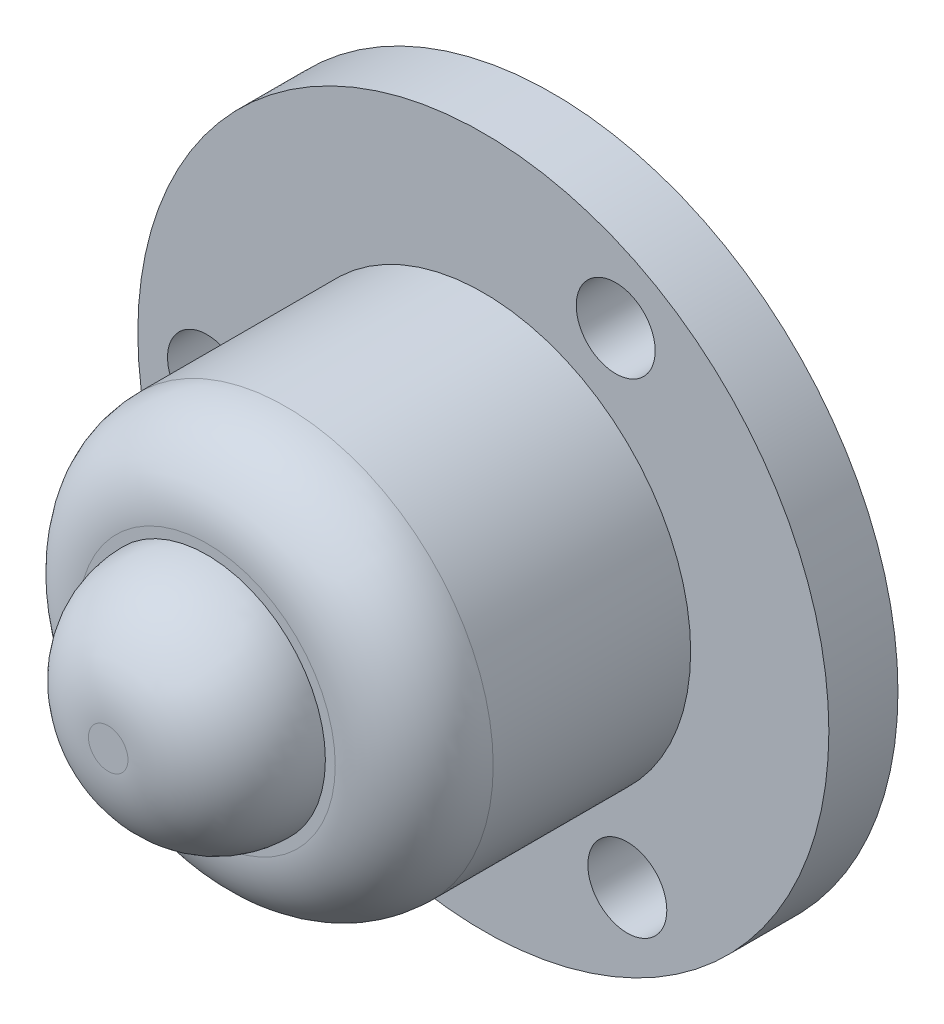
ISO-10303-21;
HEADER;
FILE_DESCRIPTION(('STEP AP214'),'2;1');
FILE_NAME('part.step','',(''),(''),'','','');
FILE_SCHEMA(('AUTOMOTIVE_DESIGN { 1 0 10303 214 1 1 1 1 }'));
ENDSEC;
DATA;
#1=APPLICATION_CONTEXT('core data for automotive mechanical design processes');
#2=APPLICATION_PROTOCOL_DEFINITION('international standard','automotive_design',2000,#1);
#3=PRODUCT_CONTEXT('',#1,'mechanical');
#4=PRODUCT('Part','Part','',(#3));
#5=PRODUCT_RELATED_PRODUCT_CATEGORY('part','',(#4));
#6=PRODUCT_DEFINITION_FORMATION('','',#4);
#7=PRODUCT_DEFINITION_CONTEXT('part definition',#1,'design');
#8=PRODUCT_DEFINITION('design','',#6,#7);
#9=PRODUCT_DEFINITION_SHAPE('','',#8);
#10=(LENGTH_UNIT() NAMED_UNIT(*) SI_UNIT(.MILLI.,.METRE.));
#11=(NAMED_UNIT(*) PLANE_ANGLE_UNIT() SI_UNIT($,.RADIAN.));
#12=(NAMED_UNIT(*) SI_UNIT($,.STERADIAN.) SOLID_ANGLE_UNIT());
#13=UNCERTAINTY_MEASURE_WITH_UNIT(LENGTH_MEASURE(1.E-05),#10,'distance_accuracy_value','');
#14=(GEOMETRIC_REPRESENTATION_CONTEXT(3) GLOBAL_UNCERTAINTY_ASSIGNED_CONTEXT((#13)) GLOBAL_UNIT_ASSIGNED_CONTEXT((#10,
#11,#12)) REPRESENTATION_CONTEXT('',''));
#15=CARTESIAN_POINT('',(0.,0.,0.));
#16=DIRECTION('',(0.,0.,1.));
#17=DIRECTION('',(1.,0.,0.));
#18=AXIS2_PLACEMENT_3D('',#15,#16,#17);
#19=CARTESIAN_POINT('',(0.,0.,3.5));
#20=DIRECTION('',(0.,0.,1.));
#21=DIRECTION('',(1.,0.,0.));
#22=AXIS2_PLACEMENT_3D('',#19,#20,#21);
#23=PLANE('',#22);
#24=CARTESIAN_POINT('',(0.,0.,3.5));
#25=DIRECTION('',(0.,0.,1.));
#26=DIRECTION('',(1.,0.,0.));
#27=AXIS2_PLACEMENT_3D('',#24,#25,#26);
#28=CIRCLE('',#27,10.5);
#29=CARTESIAN_POINT('',(10.5,0.,3.5));
#30=VERTEX_POINT('',#29);
#31=EDGE_CURVE('E103',#30,#30,#28,.T.);
#32=ORIENTED_EDGE('',*,*,#31,.F.);
#33=EDGE_LOOP('',(#32));
#34=FACE_BOUND('',#33,.T.);
#35=CARTESIAN_POINT('',(7.29195323742998,-11.9510425479602,3.5));
#36=DIRECTION('',(0.,0.,1.));
#37=DIRECTION('',(1.,0.,0.));
#38=AXIS2_PLACEMENT_3D('',#35,#36,#37);
#39=CIRCLE('',#38,2.);
#40=CARTESIAN_POINT('',(9.29195323742998,-11.9510425479602,3.5));
#41=VERTEX_POINT('',#40);
#42=EDGE_CURVE('E80',#41,#41,#39,.T.);
#43=ORIENTED_EDGE('',*,*,#42,.F.);
#44=EDGE_LOOP('',(#43));
#45=FACE_BOUND('',#44,.T.);
#46=CARTESIAN_POINT('',(0.,0.,3.5));
#47=DIRECTION('',(0.,0.,1.));
#48=DIRECTION('',(1.,0.,0.));
#49=AXIS2_PLACEMENT_3D('',#46,#47,#48);
#50=CIRCLE('',#49,17.5);
#51=CARTESIAN_POINT('',(17.5,0.,3.5));
#52=VERTEX_POINT('',#51);
#53=EDGE_CURVE('E61',#52,#52,#50,.T.);
#54=ORIENTED_EDGE('',*,*,#53,.T.);
#55=EDGE_LOOP('',(#54));
#56=FACE_BOUND('',#55,.T.);
#57=CARTESIAN_POINT('',(6.70392982952802,12.2905380208014,3.5));
#58=DIRECTION('',(0.,0.,1.));
#59=DIRECTION('',(1.,0.,0.));
#60=AXIS2_PLACEMENT_3D('',#57,#58,#59);
#61=CIRCLE('',#60,2.);
#62=CARTESIAN_POINT('',(8.70392982952803,12.2905380208014,3.5));
#63=VERTEX_POINT('',#62);
#64=EDGE_CURVE('E75',#63,#63,#61,.T.);
#65=ORIENTED_EDGE('',*,*,#64,.F.);
#66=EDGE_LOOP('',(#65));
#67=FACE_BOUND('',#66,.T.);
#68=CARTESIAN_POINT('',(-13.9958830669558,-0.339495472842407,3.5));
#69=DIRECTION('',(0.,0.,1.));
#70=DIRECTION('',(1.,0.,0.));
#71=AXIS2_PLACEMENT_3D('',#68,#69,#70);
#72=CIRCLE('',#71,2.);
#73=CARTESIAN_POINT('',(-11.9958830669558,-0.339495472842407,3.5));
#74=VERTEX_POINT('',#73);
#75=EDGE_CURVE('E88',#74,#74,#72,.T.);
#76=ORIENTED_EDGE('',*,*,#75,.F.);
#77=EDGE_LOOP('',(#76));
#78=FACE_BOUND('',#77,.T.);
#79=ADVANCED_FACE('F43',(#34,#45,#56,#67,#78),#23,.T.);
#80=CARTESIAN_POINT('',(0.,0.,0.));
#81=DIRECTION('',(0.,0.,1.));
#82=DIRECTION('',(1.,0.,0.));
#83=AXIS2_PLACEMENT_3D('',#80,#81,#82);
#84=PLANE('',#83);
#85=CARTESIAN_POINT('',(0.,0.,0.));
#86=DIRECTION('',(0.,0.,1.));
#87=DIRECTION('',(1.,0.,0.));
#88=AXIS2_PLACEMENT_3D('',#85,#86,#87);
#89=CIRCLE('',#88,17.5);
#90=CARTESIAN_POINT('',(17.5,0.,0.));
#91=VERTEX_POINT('',#90);
#92=EDGE_CURVE('E64',#91,#91,#89,.T.);
#93=ORIENTED_EDGE('',*,*,#92,.F.);
#94=EDGE_LOOP('',(#93));
#95=FACE_BOUND('',#94,.T.);
#96=CARTESIAN_POINT('',(0.,0.,0.));
#97=DIRECTION('',(0.,0.,1.));
#98=DIRECTION('',(1.,0.,0.));
#99=AXIS2_PLACEMENT_3D('',#96,#97,#98);
#100=CIRCLE('',#99,10.);
#101=CARTESIAN_POINT('',(10.,0.,0.));
#102=VERTEX_POINT('',#101);
#103=EDGE_CURVE('E68',#102,#102,#100,.T.);
#104=ORIENTED_EDGE('',*,*,#103,.T.);
#105=EDGE_LOOP('',(#104));
#106=FACE_BOUND('',#105,.T.);
#107=CARTESIAN_POINT('',(6.70392982952802,12.2905380208014,0.));
#108=DIRECTION('',(0.,0.,1.));
#109=DIRECTION('',(1.,0.,0.));
#110=AXIS2_PLACEMENT_3D('',#107,#108,#109);
#111=CIRCLE('',#110,2.);
#112=CARTESIAN_POINT('',(8.70392982952803,12.2905380208014,0.));
#113=VERTEX_POINT('',#112);
#114=EDGE_CURVE('E76',#113,#113,#111,.T.);
#115=ORIENTED_EDGE('',*,*,#114,.T.);
#116=EDGE_LOOP('',(#115));
#117=FACE_BOUND('',#116,.T.);
#118=CARTESIAN_POINT('',(7.29195323742998,-11.9510425479602,0.));
#119=DIRECTION('',(0.,0.,1.));
#120=DIRECTION('',(1.,0.,0.));
#121=AXIS2_PLACEMENT_3D('',#118,#119,#120);
#122=CIRCLE('',#121,2.);
#123=CARTESIAN_POINT('',(9.29195323742998,-11.9510425479602,0.));
#124=VERTEX_POINT('',#123);
#125=EDGE_CURVE('E84',#124,#124,#122,.T.);
#126=ORIENTED_EDGE('',*,*,#125,.T.);
#127=EDGE_LOOP('',(#126));
#128=FACE_BOUND('',#127,.T.);
#129=CARTESIAN_POINT('',(-13.9958830669558,-0.339495472842407,0.));
#130=DIRECTION('',(0.,0.,1.));
#131=DIRECTION('',(1.,0.,0.));
#132=AXIS2_PLACEMENT_3D('',#129,#130,#131);
#133=CIRCLE('',#132,2.);
#134=CARTESIAN_POINT('',(-11.9958830669558,-0.339495472842407,0.));
#135=VERTEX_POINT('',#134);
#136=EDGE_CURVE('E92',#135,#135,#133,.T.);
#137=ORIENTED_EDGE('',*,*,#136,.T.);
#138=EDGE_LOOP('',(#137));
#139=FACE_BOUND('',#138,.T.);
#140=ADVANCED_FACE('F131',(#95,#106,#117,#128,#139),#84,.F.);
#141=CARTESIAN_POINT('',(0.,0.,3.5));
#142=DIRECTION('',(0.,0.,-1.));
#143=DIRECTION('',(-1.,0.,0.));
#144=AXIS2_PLACEMENT_3D('',#141,#142,#143);
#145=CYLINDRICAL_SURFACE('',#144,17.5);
#146=ORIENTED_EDGE('',*,*,#53,.F.);
#147=EDGE_LOOP('',(#146));
#148=FACE_BOUND('',#147,.T.);
#149=ORIENTED_EDGE('',*,*,#92,.T.);
#150=EDGE_LOOP('',(#149));
#151=FACE_BOUND('',#150,.T.);
#152=ADVANCED_FACE('F137',(#148,#151),#145,.T.);
#153=CARTESIAN_POINT('',(0.,0.,3.5));
#154=DIRECTION('',(0.,0.,-1.));
#155=DIRECTION('',(-1.,0.,0.));
#156=AXIS2_PLACEMENT_3D('',#153,#154,#155);
#157=CYLINDRICAL_SURFACE('',#156,10.);
#158=CARTESIAN_POINT('',(0.,0.,3.5));
#159=DIRECTION('',(0.,0.,1.));
#160=DIRECTION('',(1.,0.,0.));
#161=AXIS2_PLACEMENT_3D('',#158,#159,#160);
#162=CIRCLE('',#161,10.);
#163=CARTESIAN_POINT('',(10.,0.,3.5));
#164=VERTEX_POINT('',#163);
#165=EDGE_CURVE('E96',#164,#164,#162,.T.);
#166=ORIENTED_EDGE('',*,*,#165,.T.);
#167=EDGE_LOOP('',(#166));
#168=FACE_BOUND('',#167,.T.);
#169=ORIENTED_EDGE('',*,*,#103,.F.);
#170=EDGE_LOOP('',(#169));
#171=FACE_BOUND('',#170,.T.);
#172=ADVANCED_FACE('F143',(#168,#171),#157,.F.);
#173=CARTESIAN_POINT('',(6.70392982952802,12.2905380208014,3.5));
#174=DIRECTION('',(0.,0.,-1.));
#175=DIRECTION('',(-1.,0.,0.));
#176=AXIS2_PLACEMENT_3D('',#173,#174,#175);
#177=CYLINDRICAL_SURFACE('',#176,2.);
#178=ORIENTED_EDGE('',*,*,#64,.T.);
#179=EDGE_LOOP('',(#178));
#180=FACE_BOUND('',#179,.T.);
#181=ORIENTED_EDGE('',*,*,#114,.F.);
#182=EDGE_LOOP('',(#181));
#183=FACE_BOUND('',#182,.T.);
#184=ADVANCED_FACE('F150',(#180,#183),#177,.F.);
#185=CARTESIAN_POINT('',(7.29195323742998,-11.9510425479602,3.5));
#186=DIRECTION('',(0.,0.,-1.));
#187=DIRECTION('',(-1.,0.,0.));
#188=AXIS2_PLACEMENT_3D('',#185,#186,#187);
#189=CYLINDRICAL_SURFACE('',#188,2.);
#190=ORIENTED_EDGE('',*,*,#42,.T.);
#191=EDGE_LOOP('',(#190));
#192=FACE_BOUND('',#191,.T.);
#193=ORIENTED_EDGE('',*,*,#125,.F.);
#194=EDGE_LOOP('',(#193));
#195=FACE_BOUND('',#194,.T.);
#196=ADVANCED_FACE('F167',(#192,#195),#189,.F.);
#197=CARTESIAN_POINT('',(-13.9958830669558,-0.339495472842407,3.5));
#198=DIRECTION('',(0.,0.,-1.));
#199=DIRECTION('',(-1.,0.,0.));
#200=AXIS2_PLACEMENT_3D('',#197,#198,#199);
#201=CYLINDRICAL_SURFACE('',#200,2.);
#202=ORIENTED_EDGE('',*,*,#75,.T.);
#203=EDGE_LOOP('',(#202));
#204=FACE_BOUND('',#203,.T.);
#205=ORIENTED_EDGE('',*,*,#136,.F.);
#206=EDGE_LOOP('',(#205));
#207=FACE_BOUND('',#206,.T.);
#208=ADVANCED_FACE('F164',(#204,#207),#201,.F.);
#209=CARTESIAN_POINT('',(0.,0.,3.5));
#210=DIRECTION('',(0.,0.,1.));
#211=DIRECTION('',(1.,0.,0.));
#212=AXIS2_PLACEMENT_3D('',#209,#210,#211);
#213=PLANE('',#212);
#214=ORIENTED_EDGE('',*,*,#165,.F.);
#215=EDGE_LOOP('',(#214));
#216=FACE_BOUND('',#215,.T.);
#217=ADVANCED_FACE('F166',(#216),#213,.F.);
#218=CARTESIAN_POINT('',(0.,0.,17.5));
#219=DIRECTION('',(0.,0.,-1.));
#220=DIRECTION('',(-1.,0.,0.));
#221=AXIS2_PLACEMENT_3D('',#218,#219,#220);
#222=CYLINDRICAL_SURFACE('',#221,10.5);
#223=CARTESIAN_POINT('',(0.,0.,13.5));
#224=DIRECTION('',(0.,0.,1.));
#225=DIRECTION('',(1.,0.,0.));
#226=AXIS2_PLACEMENT_3D('',#223,#224,#225);
#227=CIRCLE('',#226,10.5);
#228=CARTESIAN_POINT('',(10.5,0.,13.5));
#229=VERTEX_POINT('',#228);
#230=EDGE_CURVE('E51',#229,#229,#227,.F.);
#231=ORIENTED_EDGE('',*,*,#230,.T.);
#232=EDGE_LOOP('',(#231));
#233=FACE_BOUND('',#232,.T.);
#234=ORIENTED_EDGE('',*,*,#31,.T.);
#235=EDGE_LOOP('',(#234));
#236=FACE_BOUND('',#235,.T.);
#237=ADVANCED_FACE('F118',(#233,#236),#222,.T.);
#238=CARTESIAN_POINT('',(0.,0.,17.5));
#239=DIRECTION('',(0.,0.,1.));
#240=DIRECTION('',(1.,0.,0.));
#241=AXIS2_PLACEMENT_3D('',#238,#239,#240);
#242=PLANE('',#241);
#243=CARTESIAN_POINT('',(0.,0.,17.5));
#244=DIRECTION('',(0.,0.,1.));
#245=DIRECTION('',(1.,0.,0.));
#246=AXIS2_PLACEMENT_3D('',#243,#244,#245);
#247=CIRCLE('',#246,6.);
#248=CARTESIAN_POINT('',(6.,0.,17.5));
#249=VERTEX_POINT('',#248);
#250=EDGE_CURVE('E107',#249,#249,#247,.T.);
#251=ORIENTED_EDGE('',*,*,#250,.F.);
#252=EDGE_LOOP('',(#251));
#253=FACE_BOUND('',#252,.T.);
#254=CARTESIAN_POINT('',(0.,0.,17.5));
#255=DIRECTION('',(0.,0.,1.));
#256=DIRECTION('',(1.,0.,0.));
#257=AXIS2_PLACEMENT_3D('',#254,#255,#256);
#258=CIRCLE('',#257,6.5);
#259=CARTESIAN_POINT('',(6.5,0.,17.5));
#260=VERTEX_POINT('',#259);
#261=EDGE_CURVE('E56',#260,#260,#258,.T.);
#262=ORIENTED_EDGE('',*,*,#261,.T.);
#263=EDGE_LOOP('',(#262));
#264=FACE_BOUND('',#263,.T.);
#265=ADVANCED_FACE('F114',(#253,#264),#242,.T.);
#266=CARTESIAN_POINT('',(0.,0.,13.5));
#267=DIRECTION('',(0.,0.,1.));
#268=DIRECTION('',(1.,0.,0.));
#269=AXIS2_PLACEMENT_3D('',#266,#267,#268);
#270=TOROIDAL_SURFACE('',#269,6.5,4.);
#271=ORIENTED_EDGE('',*,*,#230,.F.);
#272=EDGE_LOOP('',(#271));
#273=FACE_BOUND('',#272,.T.);
#274=ORIENTED_EDGE('',*,*,#261,.F.);
#275=EDGE_LOOP('',(#274));
#276=FACE_BOUND('',#275,.T.);
#277=ADVANCED_FACE('F117',(#273,#276),#270,.T.);
#278=CARTESIAN_POINT('',(0.,0.,22.5));
#279=DIRECTION('',(0.,0.,1.));
#280=DIRECTION('',(1.,0.,0.));
#281=AXIS2_PLACEMENT_3D('',#278,#279,#280);
#282=PLANE('',#281);
#283=CARTESIAN_POINT('',(0.,0.,22.5));
#284=DIRECTION('',(0.,0.,1.));
#285=DIRECTION('',(1.,0.,0.));
#286=AXIS2_PLACEMENT_3D('',#283,#284,#285);
#287=CIRCLE('',#286,1.);
#288=CARTESIAN_POINT('',(1.,0.,22.5));
#289=VERTEX_POINT('',#288);
#290=EDGE_CURVE('E10',#289,#289,#287,.T.);
#291=ORIENTED_EDGE('',*,*,#290,.T.);
#292=EDGE_LOOP('',(#291));
#293=FACE_BOUND('',#292,.T.);
#294=ADVANCED_FACE('F123',(#293),#282,.T.);
#295=CARTESIAN_POINT('',(0.,0.,17.5));
#296=DIRECTION('',(0.,0.,1.));
#297=DIRECTION('',(1.,0.,0.));
#298=AXIS2_PLACEMENT_3D('',#295,#296,#297);
#299=DEGENERATE_TOROIDAL_SURFACE('',#298,1.,5.,.T.);
#300=ORIENTED_EDGE('',*,*,#250,.T.);
#301=EDGE_LOOP('',(#300));
#302=FACE_BOUND('',#301,.T.);
#303=ORIENTED_EDGE('',*,*,#290,.F.);
#304=EDGE_LOOP('',(#303));
#305=FACE_BOUND('',#304,.T.);
#306=ADVANCED_FACE('F45',(#302,#305),#299,.T.);
#307=CLOSED_SHELL('',(#79,#140,#152,#172,#184,#196,#208,#217,#237,#265,#277,#294,#306));
#308=MANIFOLD_SOLID_BREP('B2',#307);
#309=ADVANCED_BREP_SHAPE_REPRESENTATION('',(#18,#308),#14);
#310=SHAPE_DEFINITION_REPRESENTATION(#9,#309);
ENDSEC;
END-ISO-10303-21;
